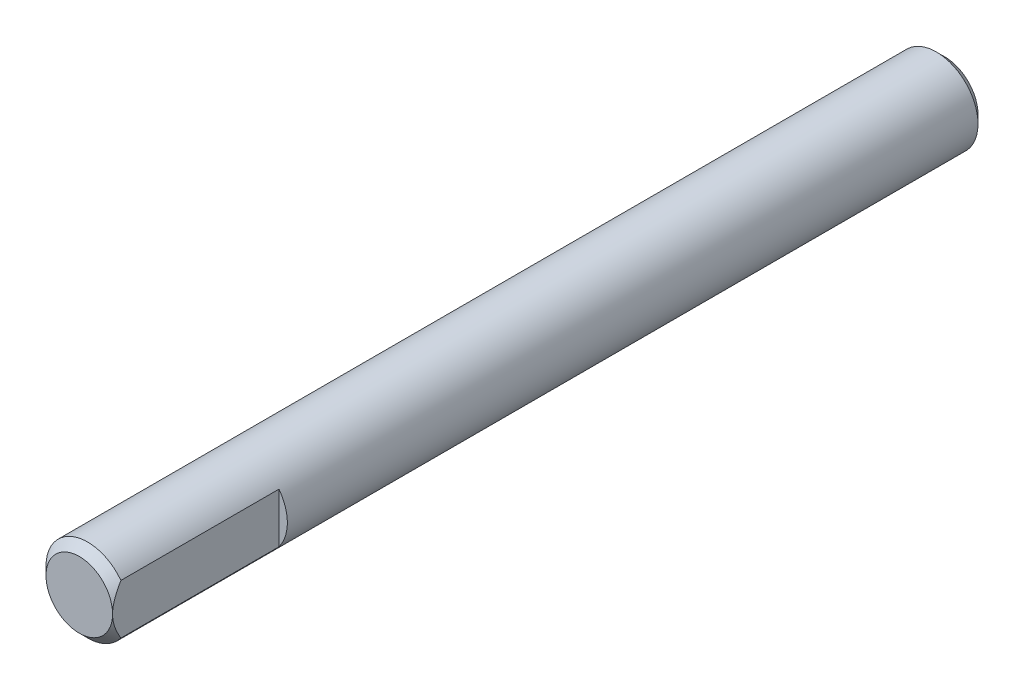
ISO-10303-21;
HEADER;
FILE_DESCRIPTION(('STEP AP214'),'2;1');
FILE_NAME('part.step','',(''),(''),'','','');
FILE_SCHEMA(('AUTOMOTIVE_DESIGN { 1 0 10303 214 1 1 1 1 }'));
ENDSEC;
DATA;
#1=APPLICATION_CONTEXT('core data for automotive mechanical design processes');
#2=APPLICATION_PROTOCOL_DEFINITION('international standard','automotive_design',2000,#1);
#3=PRODUCT_CONTEXT('',#1,'mechanical');
#4=PRODUCT('Part','Part','',(#3));
#5=PRODUCT_RELATED_PRODUCT_CATEGORY('part','',(#4));
#6=PRODUCT_DEFINITION_FORMATION('','',#4);
#7=PRODUCT_DEFINITION_CONTEXT('part definition',#1,'design');
#8=PRODUCT_DEFINITION('design','',#6,#7);
#9=PRODUCT_DEFINITION_SHAPE('','',#8);
#10=(LENGTH_UNIT() NAMED_UNIT(*) SI_UNIT(.MILLI.,.METRE.));
#11=(NAMED_UNIT(*) PLANE_ANGLE_UNIT() SI_UNIT($,.RADIAN.));
#12=(NAMED_UNIT(*) SI_UNIT($,.STERADIAN.) SOLID_ANGLE_UNIT());
#13=UNCERTAINTY_MEASURE_WITH_UNIT(LENGTH_MEASURE(1.E-05),#10,'distance_accuracy_value','');
#14=(GEOMETRIC_REPRESENTATION_CONTEXT(3) GLOBAL_UNCERTAINTY_ASSIGNED_CONTEXT((#13)) GLOBAL_UNIT_ASSIGNED_CONTEXT((#10,
#11,#12)) REPRESENTATION_CONTEXT('',''));
#15=CARTESIAN_POINT('',(0.,0.,0.));
#16=DIRECTION('',(0.,0.,1.));
#17=DIRECTION('',(1.,0.,0.));
#18=AXIS2_PLACEMENT_3D('',#15,#16,#17);
#19=CARTESIAN_POINT('',(0.,0.,52.));
#20=DIRECTION('',(0.,0.,-1.));
#21=DIRECTION('',(-1.,0.,0.));
#22=AXIS2_PLACEMENT_3D('',#19,#20,#21);
#23=CYLINDRICAL_SURFACE('',#22,2.5);
#24=CARTESIAN_POINT('',(0.,0.,51.5));
#25=DIRECTION('',(0.,0.,1.));
#26=DIRECTION('',(1.,0.,0.));
#27=AXIS2_PLACEMENT_3D('',#24,#25,#26);
#28=CIRCLE('',#27,2.5);
#29=CARTESIAN_POINT('',(2.,-1.5,51.5));
#30=VERTEX_POINT('',#29);
#31=CARTESIAN_POINT('',(2.,1.50000000000001,51.5));
#32=VERTEX_POINT('',#31);
#33=EDGE_CURVE('E83',#30,#32,#28,.F.);
#34=ORIENTED_EDGE('',*,*,#33,.T.);
#35=DIRECTION('',(0.,0.,-1.));
#36=VECTOR('',#35,1.);
#37=CARTESIAN_POINT('',(2.,1.5,52.));
#38=LINE('',#37,#36);
#39=CARTESIAN_POINT('',(2.,1.5,42.));
#40=VERTEX_POINT('',#39);
#41=EDGE_CURVE('E62',#32,#40,#38,.T.);
#42=ORIENTED_EDGE('',*,*,#41,.T.);
#43=CARTESIAN_POINT('',(0.,0.,42.));
#44=DIRECTION('',(0.,0.,-1.));
#45=DIRECTION('',(-1.,0.,0.));
#46=AXIS2_PLACEMENT_3D('',#43,#44,#45);
#47=CIRCLE('',#46,2.5);
#48=CARTESIAN_POINT('',(2.,-1.5,42.));
#49=VERTEX_POINT('',#48);
#50=EDGE_CURVE('E11',#40,#49,#47,.T.);
#51=ORIENTED_EDGE('',*,*,#50,.T.);
#52=DIRECTION('',(0.,0.,-1.));
#53=VECTOR('',#52,1.);
#54=CARTESIAN_POINT('',(2.,-1.5,52.));
#55=LINE('',#54,#53);
#56=EDGE_CURVE('E77',#49,#30,#55,.F.);
#57=ORIENTED_EDGE('',*,*,#56,.T.);
#58=EDGE_LOOP('',(#34,#42,#51,#57));
#59=FACE_BOUND('',#58,.T.);
#60=CARTESIAN_POINT('',(0.,0.,0.500000000000021));
#61=DIRECTION('',(0.,0.,1.));
#62=DIRECTION('',(1.,0.,0.));
#63=AXIS2_PLACEMENT_3D('',#60,#61,#62);
#64=CIRCLE('',#63,2.5);
#65=CARTESIAN_POINT('',(2.5,0.,0.500000000000021));
#66=VERTEX_POINT('',#65);
#67=EDGE_CURVE('E90',#66,#66,#64,.T.);
#68=ORIENTED_EDGE('',*,*,#67,.T.);
#69=EDGE_LOOP('',(#68));
#70=FACE_BOUND('',#69,.T.);
#71=ADVANCED_FACE('F41',(#59,#70),#23,.T.);
#72=CARTESIAN_POINT('',(0.,0.,52.));
#73=DIRECTION('',(0.,0.,1.));
#74=DIRECTION('',(1.,0.,0.));
#75=AXIS2_PLACEMENT_3D('',#72,#73,#74);
#76=PLANE('',#75);
#77=CARTESIAN_POINT('',(0.,0.,52.));
#78=DIRECTION('',(0.,0.,1.));
#79=DIRECTION('',(1.,0.,0.));
#80=AXIS2_PLACEMENT_3D('',#77,#78,#79);
#81=CIRCLE('',#80,2.00000000000003);
#82=CARTESIAN_POINT('',(2.00000000000003,0.,52.));
#83=VERTEX_POINT('',#82);
#84=EDGE_CURVE('E85',#83,#83,#81,.T.);
#85=ORIENTED_EDGE('',*,*,#84,.T.);
#86=EDGE_LOOP('',(#85));
#87=FACE_BOUND('',#86,.T.);
#88=ADVANCED_FACE('F117',(#87),#76,.T.);
#89=CARTESIAN_POINT('',(0.,0.,0.));
#90=DIRECTION('',(0.,0.,1.));
#91=DIRECTION('',(1.,0.,0.));
#92=AXIS2_PLACEMENT_3D('',#89,#90,#91);
#93=PLANE('',#92);
#94=CARTESIAN_POINT('',(0.,0.,0.));
#95=DIRECTION('',(0.,0.,1.));
#96=DIRECTION('',(1.,0.,0.));
#97=AXIS2_PLACEMENT_3D('',#94,#95,#96);
#98=CIRCLE('',#97,1.99999999999998);
#99=CARTESIAN_POINT('',(1.99999999999998,0.,0.));
#100=VERTEX_POINT('',#99);
#101=EDGE_CURVE('E99',#100,#100,#98,.F.);
#102=ORIENTED_EDGE('',*,*,#101,.T.);
#103=EDGE_LOOP('',(#102));
#104=FACE_BOUND('',#103,.T.);
#105=ADVANCED_FACE('F120',(#104),#93,.F.);
#106=CARTESIAN_POINT('',(0.,0.,52.));
#107=DIRECTION('',(0.,0.,-1.));
#108=DIRECTION('',(-1.,0.,0.));
#109=AXIS2_PLACEMENT_3D('',#106,#107,#108);
#110=CONICAL_SURFACE('',#109,2.00000000000003,0.785398163397439);
#111=CARTESIAN_POINT('',(2.,6.17766289822695,47.5066558011968));
#112=CARTESIAN_POINT('',(2.,6.07071919882343,47.6083983792633));
#113=CARTESIAN_POINT('',(2.,5.96365250397537,47.7100116540941));
#114=CARTESIAN_POINT('',(2.,5.7492271380846,47.9129309610003));
#115=CARTESIAN_POINT('',(2.,5.64186846522979,48.0142369911607));
#116=CARTESIAN_POINT('',(2.,5.31919930825561,48.3177023040821));
#117=CARTESIAN_POINT('',(2.,5.10338332362652,48.5193252818121));
#118=CARTESIAN_POINT('',(2.,4.66727211050627,48.9229426559899));
#119=CARTESIAN_POINT('',(2.,4.44695419178026,49.1249125836751));
#120=CARTESIAN_POINT('',(2.,4.00356728710398,49.5256856542741));
#121=CARTESIAN_POINT('',(2.,3.78049916581564,49.724489749638));
#122=CARTESIAN_POINT('',(2.,3.38381280147157,50.0702269096672));
#123=CARTESIAN_POINT('',(2.,3.21111166867094,50.218205973834));
#124=CARTESIAN_POINT('',(2.,2.94921367296464,50.4369144972077));
#125=CARTESIAN_POINT('',(2.,2.86140360470762,50.5093028179361));
#126=CARTESIAN_POINT('',(2.,2.68464185247114,50.6526696730997));
#127=CARTESIAN_POINT('',(2.,2.59569020649038,50.7236482542602));
#128=CARTESIAN_POINT('',(2.,2.41655758631238,50.8636590252871));
#129=CARTESIAN_POINT('',(2.,2.32637951132247,50.9326949124341));
#130=CARTESIAN_POINT('',(2.,2.14427312947157,51.0684106032487));
#131=CARTESIAN_POINT('',(2.,2.05234499578098,51.1350906381852));
#132=CARTESIAN_POINT('',(2.,1.86638561608343,51.2652263700979));
#133=CARTESIAN_POINT('',(2.,1.77235704930695,51.3286858707291));
#134=CARTESIAN_POINT('',(2.,1.58154464177562,51.4512895550433));
#135=CARTESIAN_POINT('',(2.,1.48476173800516,51.5104351824133));
#136=CARTESIAN_POINT('',(2.,1.31308517523641,51.60822292818));
#137=CARTESIAN_POINT('',(2.,1.2389755210088,51.6482218446068));
#138=CARTESIAN_POINT('',(2.,1.08858759386828,51.7238682556223));
#139=CARTESIAN_POINT('',(2.,1.01230881406814,51.7595147226437));
#140=CARTESIAN_POINT('',(2.,0.780425014482651,51.8576585695263));
#141=CARTESIAN_POINT('',(2.,0.620895631504848,51.911894128549));
#142=CARTESIAN_POINT('',(2.,0.39896381518791,51.9613974948378));
#143=CARTESIAN_POINT('',(2.,0.339941347000384,51.9721703173995));
#144=CARTESIAN_POINT('',(2.,0.221185102971565,51.9886635694406));
#145=CARTESIAN_POINT('',(2.,0.161451452447643,51.9943848760743));
#146=CARTESIAN_POINT('',(2.,0.0417662612412273,52.0004562719579));
#147=CARTESIAN_POINT('',(2.,-0.0181850208163301,52.0008114217687));
#148=CARTESIAN_POINT('',(2.,-0.137879242528497,51.9961452292003));
#149=CARTESIAN_POINT('',(2.,-0.197622167903268,51.9911235253079));
#150=CARTESIAN_POINT('',(2.,-0.316091629450981,51.9760236664177));
#151=CARTESIAN_POINT('',(2.,-0.374822108937803,51.9659759580572));
#152=CARTESIAN_POINT('',(2.,-0.491321742736436,51.9413225905701));
#153=CARTESIAN_POINT('',(2.,-0.549090635218789,51.9267157107443));
#154=CARTESIAN_POINT('',(2.,-0.663603293431159,51.8934964315297));
#155=CARTESIAN_POINT('',(2.,-0.720344249631072,51.8748744532725));
#156=CARTESIAN_POINT('',(2.,-0.832584028166229,51.8342531140273));
#157=CARTESIAN_POINT('',(2.,-0.888082972450365,51.8122540863022));
#158=CARTESIAN_POINT('',(2.,-1.02942150665731,51.7519819553482));
#159=CARTESIAN_POINT('',(2.,-1.11436920432073,51.7116215682589));
#160=CARTESIAN_POINT('',(2.,-1.28160448686398,51.6256871568635));
#161=CARTESIAN_POINT('',(2.,-1.36389029924584,51.5801097467117));
#162=CARTESIAN_POINT('',(2.,-1.52636711574638,51.4849548017457));
#163=CARTESIAN_POINT('',(2.,-1.60655253086441,51.435367796486));
#164=CARTESIAN_POINT('',(2.,-1.76499012657487,51.3332557222486));
#165=CARTESIAN_POINT('',(2.,-1.84324274516775,51.280731327899));
#166=CARTESIAN_POINT('',(2.,-1.99912784594369,51.1727552371304));
#167=CARTESIAN_POINT('',(2.,-2.07674075863609,51.1172754153208));
#168=CARTESIAN_POINT('',(2.,-2.23063923355658,51.0045001590515));
#169=CARTESIAN_POINT('',(2.,-2.30692469812394,50.9472045918744));
#170=CARTESIAN_POINT('',(2.,-2.53391646996487,50.7733586565537));
#171=CARTESIAN_POINT('',(2.,-2.6829929360282,50.6546828414517));
#172=CARTESIAN_POINT('',(2.,-2.97773053078442,50.4139543894634));
#173=CARTESIAN_POINT('',(2.,-3.12339939399765,50.2919111273342));
#174=CARTESIAN_POINT('',(2.,-3.41256564797993,50.0452670017388));
#175=CARTESIAN_POINT('',(2.,-3.55606290550929,49.9206659824368));
#176=CARTESIAN_POINT('',(2.,-3.8415490920352,49.6695383434139));
#177=CARTESIAN_POINT('',(2.,-3.98353680391816,49.5430103443881));
#178=CARTESIAN_POINT('',(2.,-4.26628508222412,49.288589514221));
#179=CARTESIAN_POINT('',(2.,-4.40704563498303,49.1606966679177));
#180=CARTESIAN_POINT('',(2.,-4.68100632309957,48.909918614999));
#181=CARTESIAN_POINT('',(2.,-4.81425030751209,48.7870812450726));
#182=CARTESIAN_POINT('',(2.,-5.08004720365259,48.5406592360021));
#183=CARTESIAN_POINT('',(2.,-5.21260010915356,48.4170745901462));
#184=CARTESIAN_POINT('',(2.,-5.47698483853067,48.1694585236122));
#185=CARTESIAN_POINT('',(2.,-5.60881734366516,48.0454278297453));
#186=CARTESIAN_POINT('',(2.,-5.87201604536713,47.7968776805591));
#187=CARTESIAN_POINT('',(2.,-6.00338225100691,47.6723582348494));
#188=CARTESIAN_POINT('',(2.,-6.1345640963963,47.5476456504005));
#189=B_SPLINE_CURVE_WITH_KNOTS('',3,(#111,#112,#113,#114,#115,#116,#117,#118,#119,#120,#121,
#122,#123,#124,#125,#126,#127,#128,#129,#130,#131,#132,#133,#134,#135,#136,#137,#138,#139,#140,
#141,#142,#143,#144,#145,#146,#147,#148,#149,#150,#151,#152,#153,#154,#155,#156,#157,#158,#159,
#160,#161,#162,#163,#164,#165,#166,#167,#168,#169,#170,#171,#172,#173,#174,#175,#176,#177,#178,
#179,#180,#181,#182,#183,#184,#185,#186,#187,#188),.UNSPECIFIED.,.F.,.F.,(4,2,2,2,2,2,2,2,2,2,2,
2,2,2,2,2,2,2,2,2,2,2,2,2,2,2,2,2,2,2,2,2,2,2,2,2,2,2,4),(0.,0.442827677125984,
0.885658108868881,1.77168216773581,2.66831708835244,3.56467695343453,4.24690472416245,
4.58829688209906,4.92967770573851,5.27035757129128,5.61100389960149,5.95123806451591,
6.29135783869747,6.54385816905948,6.79641799729117,7.2984747026785,7.47828933850484,
7.65807274484732,7.83768659562437,8.01731252350624,8.19586325333195,8.3744618304466,
8.55349130235717,8.73250311816195,9.01438480907514,9.29645048957817,9.57920302843223,
9.86189089228358,10.1480672399252,10.434264553377,11.0057968420885,11.5758728470642,
12.1459836886093,12.7165238163308,13.2870702887662,13.8307458257771,14.3744262531773,
14.9174449878623,15.4604530990604),.UNSPECIFIED.);
#190=EDGE_CURVE('E51',#32,#83,#189,.T.);
#191=ORIENTED_EDGE('',*,*,#190,.F.);
#192=ORIENTED_EDGE('',*,*,#33,.F.);
#193=EDGE_CURVE('E102',#83,#30,#189,.T.);
#194=ORIENTED_EDGE('',*,*,#193,.F.);
#195=ORIENTED_EDGE('',*,*,#84,.F.);
#196=EDGE_LOOP('',(#191,#192,#194,#195));
#197=FACE_BOUND('',#196,.T.);
#198=ADVANCED_FACE('F110',(#197),#110,.T.);
#199=CARTESIAN_POINT('',(0.,0.,0.500000000000021));
#200=DIRECTION('',(0.,0.,1.));
#201=DIRECTION('',(1.,0.,0.));
#202=AXIS2_PLACEMENT_3D('',#199,#200,#201);
#203=CONICAL_SURFACE('',#202,2.5,0.785398163397446);
#204=ORIENTED_EDGE('',*,*,#101,.F.);
#205=EDGE_LOOP('',(#204));
#206=FACE_BOUND('',#205,.T.);
#207=ORIENTED_EDGE('',*,*,#67,.F.);
#208=EDGE_LOOP('',(#207));
#209=FACE_BOUND('',#208,.T.);
#210=ADVANCED_FACE('F44',(#206,#209),#203,.T.);
#211=CARTESIAN_POINT('',(0.,0.,42.));
#212=DIRECTION('',(0.,0.,-1.));
#213=DIRECTION('',(-1.,0.,0.));
#214=AXIS2_PLACEMENT_3D('',#211,#212,#213);
#215=PLANE('',#214);
#216=DIRECTION('',(0.,-1.,0.));
#217=VECTOR('',#216,1.);
#218=CARTESIAN_POINT('',(2.,2.06335513762513,42.));
#219=LINE('',#218,#217);
#220=EDGE_CURVE('E73',#40,#49,#219,.T.);
#221=ORIENTED_EDGE('',*,*,#220,.T.);
#222=ORIENTED_EDGE('',*,*,#50,.F.);
#223=EDGE_LOOP('',(#221,#222));
#224=FACE_BOUND('',#223,.T.);
#225=ADVANCED_FACE('F72',(#224),#215,.F.);
#226=CARTESIAN_POINT('',(2.,2.06335513762513,42.));
#227=DIRECTION('',(-1.,0.,0.));
#228=DIRECTION('',(0.,-1.,0.));
#229=AXIS2_PLACEMENT_3D('',#226,#227,#228);
#230=PLANE('',#229);
#231=ORIENTED_EDGE('',*,*,#190,.T.);
#232=ORIENTED_EDGE('',*,*,#193,.T.);
#233=ORIENTED_EDGE('',*,*,#56,.F.);
#234=ORIENTED_EDGE('',*,*,#220,.F.);
#235=ORIENTED_EDGE('',*,*,#41,.F.);
#236=EDGE_LOOP('',(#231,#232,#233,#234,#235));
#237=FACE_BOUND('',#236,.T.);
#238=ADVANCED_FACE('F76',(#237),#230,.F.);
#239=CLOSED_SHELL('',(#71,#88,#105,#198,#210,#225,#238));
#240=MANIFOLD_SOLID_BREP('B2',#239);
#241=ADVANCED_BREP_SHAPE_REPRESENTATION('',(#18,#240),#14);
#242=SHAPE_DEFINITION_REPRESENTATION(#9,#241);
ENDSEC;
END-ISO-10303-21;
